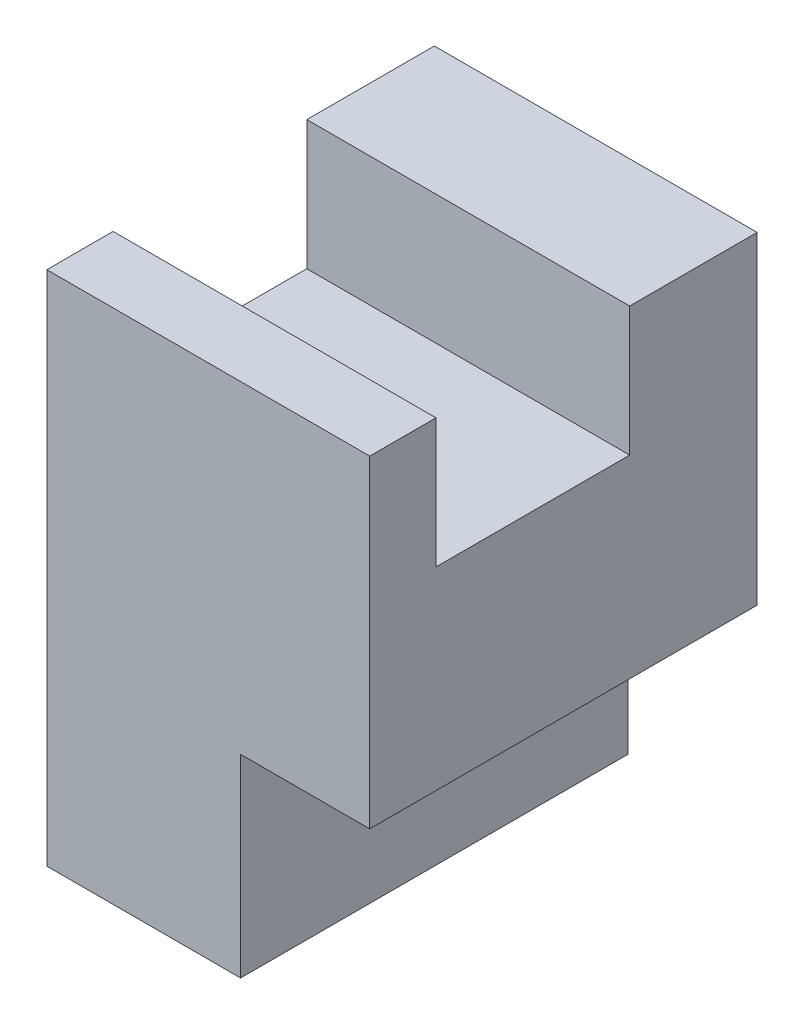
ISO-10303-21;
HEADER;
FILE_DESCRIPTION(('STEP AP214'),'2;1');
FILE_NAME('part.step','',(''),(''),'','','');
FILE_SCHEMA(('AUTOMOTIVE_DESIGN { 1 0 10303 214 1 1 1 1 }'));
ENDSEC;
DATA;
#1=APPLICATION_CONTEXT('core data for automotive mechanical design processes');
#2=APPLICATION_PROTOCOL_DEFINITION('international standard','automotive_design',2000,#1);
#3=PRODUCT_CONTEXT('',#1,'mechanical');
#4=PRODUCT('Part','Part','',(#3));
#5=PRODUCT_RELATED_PRODUCT_CATEGORY('part','',(#4));
#6=PRODUCT_DEFINITION_FORMATION('','',#4);
#7=PRODUCT_DEFINITION_CONTEXT('part definition',#1,'design');
#8=PRODUCT_DEFINITION('design','',#6,#7);
#9=PRODUCT_DEFINITION_SHAPE('','',#8);
#10=(LENGTH_UNIT() NAMED_UNIT(*) SI_UNIT(.MILLI.,.METRE.));
#11=(NAMED_UNIT(*) PLANE_ANGLE_UNIT() SI_UNIT($,.RADIAN.));
#12=(NAMED_UNIT(*) SI_UNIT($,.STERADIAN.) SOLID_ANGLE_UNIT());
#13=UNCERTAINTY_MEASURE_WITH_UNIT(LENGTH_MEASURE(1.E-05),#10,'distance_accuracy_value','');
#14=(GEOMETRIC_REPRESENTATION_CONTEXT(3) GLOBAL_UNCERTAINTY_ASSIGNED_CONTEXT((#13)) GLOBAL_UNIT_ASSIGNED_CONTEXT((#10,
#11,#12)) REPRESENTATION_CONTEXT('',''));
#15=CARTESIAN_POINT('',(0.,0.,0.));
#16=DIRECTION('',(0.,0.,1.));
#17=DIRECTION('',(1.,0.,0.));
#18=AXIS2_PLACEMENT_3D('',#15,#16,#17);
#19=CARTESIAN_POINT('',(25000.,40000.,30000.));
#20=DIRECTION('',(0.,-1.,0.));
#21=DIRECTION('',(0.,0.,-1.));
#22=AXIS2_PLACEMENT_3D('',#19,#20,#21);
#23=PLANE('',#22);
#24=DIRECTION('',(0.,0.,-1.));
#25=VECTOR('',#24,1.);
#26=CARTESIAN_POINT('',(0.,40000.,30000.));
#27=LINE('',#26,#25);
#28=CARTESIAN_POINT('',(0.,40000.,9869.96150036873));
#29=VERTEX_POINT('',#28);
#30=CARTESIAN_POINT('',(0.,40000.,0.));
#31=VERTEX_POINT('',#30);
#32=EDGE_CURVE('E89',#29,#31,#27,.T.);
#33=ORIENTED_EDGE('',*,*,#32,.F.);
#34=DIRECTION('',(-1.,0.,0.));
#35=VECTOR('',#34,1.);
#36=CARTESIAN_POINT('',(25000.,40000.,9869.96150036873));
#37=LINE('',#36,#35);
#38=CARTESIAN_POINT('',(25000.,40000.,9869.96150036873));
#39=VERTEX_POINT('',#38);
#40=EDGE_CURVE('E174',#39,#29,#37,.T.);
#41=ORIENTED_EDGE('',*,*,#40,.F.);
#42=DIRECTION('',(0.,0.,-1.));
#43=VECTOR('',#42,1.);
#44=CARTESIAN_POINT('',(25000.,40000.,30000.));
#45=LINE('',#44,#43);
#46=CARTESIAN_POINT('',(25000.,40000.,0.));
#47=VERTEX_POINT('',#46);
#48=EDGE_CURVE('E154',#39,#47,#45,.T.);
#49=ORIENTED_EDGE('',*,*,#48,.T.);
#50=DIRECTION('',(-1.,0.,0.));
#51=VECTOR('',#50,1.);
#52=CARTESIAN_POINT('',(25000.,40000.,0.));
#53=LINE('',#52,#51);
#54=EDGE_CURVE('E148',#47,#31,#53,.T.);
#55=ORIENTED_EDGE('',*,*,#54,.T.);
#56=EDGE_LOOP('',(#33,#41,#49,#55));
#57=FACE_BOUND('',#56,.T.);
#58=ADVANCED_FACE('F37',(#57),#23,.F.);
#59=CARTESIAN_POINT('',(0.,0.,30000.));
#60=DIRECTION('',(1.,0.,0.));
#61=DIRECTION('',(0.,0.,-1.));
#62=AXIS2_PLACEMENT_3D('',#59,#60,#61);
#63=PLANE('',#62);
#64=DIRECTION('',(0.,0.,1.));
#65=VECTOR('',#64,1.);
#66=CARTESIAN_POINT('',(0.,30000.,9869.96150036873));
#67=LINE('',#66,#65);
#68=CARTESIAN_POINT('',(0.,30000.,9869.96150036873));
#69=VERTEX_POINT('',#68);
#70=CARTESIAN_POINT('',(0.,30000.,24869.9615003687));
#71=VERTEX_POINT('',#70);
#72=EDGE_CURVE('E177',#69,#71,#67,.T.);
#73=ORIENTED_EDGE('',*,*,#72,.F.);
#74=DIRECTION('',(0.,1.,0.));
#75=VECTOR('',#74,1.);
#76=CARTESIAN_POINT('',(0.,30000.,9869.96150036873));
#77=LINE('',#76,#75);
#78=EDGE_CURVE('E141',#69,#29,#77,.T.);
#79=ORIENTED_EDGE('',*,*,#78,.T.);
#80=ORIENTED_EDGE('',*,*,#32,.T.);
#81=DIRECTION('',(0.,-1.,0.));
#82=VECTOR('',#81,1.);
#83=CARTESIAN_POINT('',(0.,0.,0.));
#84=LINE('',#83,#82);
#85=CARTESIAN_POINT('',(0.,0.,0.));
#86=VERTEX_POINT('',#85);
#87=EDGE_CURVE('E138',#31,#86,#84,.T.);
#88=ORIENTED_EDGE('',*,*,#87,.T.);
#89=DIRECTION('',(0.,0.,-1.));
#90=VECTOR('',#89,1.);
#91=CARTESIAN_POINT('',(0.,0.,30000.));
#92=LINE('',#91,#90);
#93=CARTESIAN_POINT('',(0.,0.,30000.));
#94=VERTEX_POINT('',#93);
#95=EDGE_CURVE('E11',#94,#86,#92,.T.);
#96=ORIENTED_EDGE('',*,*,#95,.F.);
#97=DIRECTION('',(0.,-1.,0.));
#98=VECTOR('',#97,1.);
#99=CARTESIAN_POINT('',(0.,0.,30000.));
#100=LINE('',#99,#98);
#101=CARTESIAN_POINT('',(0.,40000.,30000.));
#102=VERTEX_POINT('',#101);
#103=EDGE_CURVE('E150',#102,#94,#100,.T.);
#104=ORIENTED_EDGE('',*,*,#103,.F.);
#105=CARTESIAN_POINT('',(0.,40000.,24869.9615003687));
#106=VERTEX_POINT('',#105);
#107=EDGE_CURVE('E151',#102,#106,#27,.T.);
#108=ORIENTED_EDGE('',*,*,#107,.T.);
#109=DIRECTION('',(0.,1.,0.));
#110=VECTOR('',#109,1.);
#111=CARTESIAN_POINT('',(0.,30000.,24869.9615003687));
#112=LINE('',#111,#110);
#113=EDGE_CURVE('E52',#71,#106,#112,.T.);
#114=ORIENTED_EDGE('',*,*,#113,.F.);
#115=EDGE_LOOP('',(#73,#79,#80,#88,#96,#104,#108,#114));
#116=FACE_BOUND('',#115,.T.);
#117=ADVANCED_FACE('F39',(#116),#63,.F.);
#118=CARTESIAN_POINT('',(0.,0.,30000.));
#119=DIRECTION('',(0.,1.,0.));
#120=DIRECTION('',(0.,0.,1.));
#121=AXIS2_PLACEMENT_3D('',#118,#119,#120);
#122=PLANE('',#121);
#123=DIRECTION('',(1.,0.,0.));
#124=VECTOR('',#123,1.);
#125=CARTESIAN_POINT('',(0.,0.,0.));
#126=LINE('',#125,#124);
#127=CARTESIAN_POINT('',(15000.,0.,0.));
#128=VERTEX_POINT('',#127);
#129=EDGE_CURVE('E140',#86,#128,#126,.T.);
#130=ORIENTED_EDGE('',*,*,#129,.T.);
#131=DIRECTION('',(0.,0.,-1.));
#132=VECTOR('',#131,1.);
#133=CARTESIAN_POINT('',(15000.,0.,30000.));
#134=LINE('',#133,#132);
#135=CARTESIAN_POINT('',(15000.,0.,30000.));
#136=VERTEX_POINT('',#135);
#137=EDGE_CURVE('E45',#136,#128,#134,.T.);
#138=ORIENTED_EDGE('',*,*,#137,.F.);
#139=DIRECTION('',(1.,0.,0.));
#140=VECTOR('',#139,1.);
#141=CARTESIAN_POINT('',(0.,0.,30000.));
#142=LINE('',#141,#140);
#143=EDGE_CURVE('E97',#94,#136,#142,.T.);
#144=ORIENTED_EDGE('',*,*,#143,.F.);
#145=ORIENTED_EDGE('',*,*,#95,.T.);
#146=EDGE_LOOP('',(#130,#138,#144,#145));
#147=FACE_BOUND('',#146,.T.);
#148=ADVANCED_FACE('F196',(#147),#122,.F.);
#149=CARTESIAN_POINT('',(15000.,0.,30000.));
#150=DIRECTION('',(-1.,0.,0.));
#151=DIRECTION('',(0.,0.,1.));
#152=AXIS2_PLACEMENT_3D('',#149,#150,#151);
#153=PLANE('',#152);
#154=DIRECTION('',(0.,1.,0.));
#155=VECTOR('',#154,1.);
#156=CARTESIAN_POINT('',(15000.,0.,0.));
#157=LINE('',#156,#155);
#158=CARTESIAN_POINT('',(15000.,15000.,0.));
#159=VERTEX_POINT('',#158);
#160=EDGE_CURVE('E143',#128,#159,#157,.T.);
#161=ORIENTED_EDGE('',*,*,#160,.T.);
#162=DIRECTION('',(0.,0.,-1.));
#163=VECTOR('',#162,1.);
#164=CARTESIAN_POINT('',(15000.,15000.,30000.));
#165=LINE('',#164,#163);
#166=CARTESIAN_POINT('',(15000.,15000.,30000.));
#167=VERTEX_POINT('',#166);
#168=EDGE_CURVE('E127',#167,#159,#165,.T.);
#169=ORIENTED_EDGE('',*,*,#168,.F.);
#170=DIRECTION('',(0.,1.,0.));
#171=VECTOR('',#170,1.);
#172=CARTESIAN_POINT('',(15000.,0.,30000.));
#173=LINE('',#172,#171);
#174=EDGE_CURVE('E114',#136,#167,#173,.T.);
#175=ORIENTED_EDGE('',*,*,#174,.F.);
#176=ORIENTED_EDGE('',*,*,#137,.T.);
#177=EDGE_LOOP('',(#161,#169,#175,#176));
#178=FACE_BOUND('',#177,.T.);
#179=ADVANCED_FACE('F159',(#178),#153,.F.);
#180=CARTESIAN_POINT('',(15000.,15000.,30000.));
#181=DIRECTION('',(0.,1.,0.));
#182=DIRECTION('',(0.,0.,1.));
#183=AXIS2_PLACEMENT_3D('',#180,#181,#182);
#184=PLANE('',#183);
#185=DIRECTION('',(1.,0.,0.));
#186=VECTOR('',#185,1.);
#187=CARTESIAN_POINT('',(15000.,15000.,0.));
#188=LINE('',#187,#186);
#189=CARTESIAN_POINT('',(25000.,15000.,0.));
#190=VERTEX_POINT('',#189);
#191=EDGE_CURVE('E123',#159,#190,#188,.T.);
#192=ORIENTED_EDGE('',*,*,#191,.T.);
#193=DIRECTION('',(0.,0.,-1.));
#194=VECTOR('',#193,1.);
#195=CARTESIAN_POINT('',(25000.,15000.,30000.));
#196=LINE('',#195,#194);
#197=CARTESIAN_POINT('',(25000.,15000.,30000.));
#198=VERTEX_POINT('',#197);
#199=EDGE_CURVE('E120',#198,#190,#196,.T.);
#200=ORIENTED_EDGE('',*,*,#199,.F.);
#201=DIRECTION('',(1.,0.,0.));
#202=VECTOR('',#201,1.);
#203=CARTESIAN_POINT('',(15000.,15000.,30000.));
#204=LINE('',#203,#202);
#205=EDGE_CURVE('E107',#167,#198,#204,.T.);
#206=ORIENTED_EDGE('',*,*,#205,.F.);
#207=ORIENTED_EDGE('',*,*,#168,.T.);
#208=EDGE_LOOP('',(#192,#200,#206,#207));
#209=FACE_BOUND('',#208,.T.);
#210=ADVANCED_FACE('F121',(#209),#184,.F.);
#211=CARTESIAN_POINT('',(25000.,15000.,30000.));
#212=DIRECTION('',(-1.,0.,0.));
#213=DIRECTION('',(0.,0.,1.));
#214=AXIS2_PLACEMENT_3D('',#211,#212,#213);
#215=PLANE('',#214);
#216=ORIENTED_EDGE('',*,*,#48,.F.);
#217=DIRECTION('',(0.,1.,0.));
#218=VECTOR('',#217,1.);
#219=CARTESIAN_POINT('',(25000.,30000.,9869.96150036873));
#220=LINE('',#219,#218);
#221=CARTESIAN_POINT('',(25000.,30000.,9869.96150036873));
#222=VERTEX_POINT('',#221);
#223=EDGE_CURVE('E169',#222,#39,#220,.T.);
#224=ORIENTED_EDGE('',*,*,#223,.F.);
#225=DIRECTION('',(0.,0.,-1.));
#226=VECTOR('',#225,1.);
#227=CARTESIAN_POINT('',(25000.,30000.,24869.9615003687));
#228=LINE('',#227,#226);
#229=CARTESIAN_POINT('',(25000.,30000.,24869.9615003687));
#230=VERTEX_POINT('',#229);
#231=EDGE_CURVE('E229',#230,#222,#228,.T.);
#232=ORIENTED_EDGE('',*,*,#231,.F.);
#233=DIRECTION('',(0.,1.,0.));
#234=VECTOR('',#233,1.);
#235=CARTESIAN_POINT('',(25000.,30000.,24869.9615003687));
#236=LINE('',#235,#234);
#237=CARTESIAN_POINT('',(25000.,40000.,24869.9615003687));
#238=VERTEX_POINT('',#237);
#239=EDGE_CURVE('E188',#230,#238,#236,.T.);
#240=ORIENTED_EDGE('',*,*,#239,.T.);
#241=CARTESIAN_POINT('',(25000.,40000.,30000.));
#242=VERTEX_POINT('',#241);
#243=EDGE_CURVE('E128',#242,#238,#45,.T.);
#244=ORIENTED_EDGE('',*,*,#243,.F.);
#245=DIRECTION('',(0.,1.,0.));
#246=VECTOR('',#245,1.);
#247=CARTESIAN_POINT('',(25000.,15000.,30000.));
#248=LINE('',#247,#246);
#249=EDGE_CURVE('E111',#198,#242,#248,.T.);
#250=ORIENTED_EDGE('',*,*,#249,.F.);
#251=ORIENTED_EDGE('',*,*,#199,.T.);
#252=DIRECTION('',(0.,1.,0.));
#253=VECTOR('',#252,1.);
#254=CARTESIAN_POINT('',(25000.,15000.,0.));
#255=LINE('',#254,#253);
#256=EDGE_CURVE('E146',#190,#47,#255,.T.);
#257=ORIENTED_EDGE('',*,*,#256,.T.);
#258=EDGE_LOOP('',(#216,#224,#232,#240,#244,#250,#251,#257));
#259=FACE_BOUND('',#258,.T.);
#260=ADVANCED_FACE('F131',(#259),#215,.F.);
#261=ORIENTED_EDGE('',*,*,#243,.T.);
#262=DIRECTION('',(1.,0.,0.));
#263=VECTOR('',#262,1.);
#264=CARTESIAN_POINT('',(0.,40000.,24869.9615003687));
#265=LINE('',#264,#263);
#266=EDGE_CURVE('E178',#106,#238,#265,.T.);
#267=ORIENTED_EDGE('',*,*,#266,.F.);
#268=ORIENTED_EDGE('',*,*,#107,.F.);
#269=DIRECTION('',(-1.,0.,0.));
#270=VECTOR('',#269,1.);
#271=CARTESIAN_POINT('',(25000.,40000.,30000.));
#272=LINE('',#271,#270);
#273=EDGE_CURVE('E61',#242,#102,#272,.T.);
#274=ORIENTED_EDGE('',*,*,#273,.F.);
#275=EDGE_LOOP('',(#261,#267,#268,#274));
#276=FACE_BOUND('',#275,.T.);
#277=ADVANCED_FACE('F205',(#276),#23,.F.);
#278=CARTESIAN_POINT('',(0.,0.,30000.));
#279=DIRECTION('',(0.,0.,1.));
#280=DIRECTION('',(1.,0.,0.));
#281=AXIS2_PLACEMENT_3D('',#278,#279,#280);
#282=PLANE('',#281);
#283=ORIENTED_EDGE('',*,*,#103,.T.);
#284=ORIENTED_EDGE('',*,*,#143,.T.);
#285=ORIENTED_EDGE('',*,*,#174,.T.);
#286=ORIENTED_EDGE('',*,*,#205,.T.);
#287=ORIENTED_EDGE('',*,*,#249,.T.);
#288=ORIENTED_EDGE('',*,*,#273,.T.);
#289=EDGE_LOOP('',(#283,#284,#285,#286,#287,#288));
#290=FACE_BOUND('',#289,.T.);
#291=ADVANCED_FACE('F109',(#290),#282,.T.);
#292=CARTESIAN_POINT('',(0.,0.,0.));
#293=DIRECTION('',(0.,0.,1.));
#294=DIRECTION('',(1.,0.,0.));
#295=AXIS2_PLACEMENT_3D('',#292,#293,#294);
#296=PLANE('',#295);
#297=ORIENTED_EDGE('',*,*,#87,.F.);
#298=ORIENTED_EDGE('',*,*,#54,.F.);
#299=ORIENTED_EDGE('',*,*,#256,.F.);
#300=ORIENTED_EDGE('',*,*,#191,.F.);
#301=ORIENTED_EDGE('',*,*,#160,.F.);
#302=ORIENTED_EDGE('',*,*,#129,.F.);
#303=EDGE_LOOP('',(#297,#298,#299,#300,#301,#302));
#304=FACE_BOUND('',#303,.T.);
#305=ADVANCED_FACE('F162',(#304),#296,.F.);
#306=CARTESIAN_POINT('',(25000.,30000.,9869.96150036873));
#307=DIRECTION('',(0.,0.,-1.));
#308=DIRECTION('',(-1.,0.,0.));
#309=AXIS2_PLACEMENT_3D('',#306,#307,#308);
#310=PLANE('',#309);
#311=ORIENTED_EDGE('',*,*,#40,.T.);
#312=ORIENTED_EDGE('',*,*,#78,.F.);
#313=DIRECTION('',(-1.,0.,0.));
#314=VECTOR('',#313,1.);
#315=CARTESIAN_POINT('',(25000.,30000.,9869.96150036873));
#316=LINE('',#315,#314);
#317=EDGE_CURVE('E191',#222,#69,#316,.T.);
#318=ORIENTED_EDGE('',*,*,#317,.F.);
#319=ORIENTED_EDGE('',*,*,#223,.T.);
#320=EDGE_LOOP('',(#311,#312,#318,#319));
#321=FACE_BOUND('',#320,.T.);
#322=ADVANCED_FACE('F234',(#321),#310,.F.);
#323=CARTESIAN_POINT('',(0.,30000.,24869.9615003687));
#324=DIRECTION('',(0.,0.,1.));
#325=DIRECTION('',(1.,0.,0.));
#326=AXIS2_PLACEMENT_3D('',#323,#324,#325);
#327=PLANE('',#326);
#328=ORIENTED_EDGE('',*,*,#266,.T.);
#329=ORIENTED_EDGE('',*,*,#239,.F.);
#330=DIRECTION('',(1.,0.,0.));
#331=VECTOR('',#330,1.);
#332=CARTESIAN_POINT('',(0.,30000.,24869.9615003687));
#333=LINE('',#332,#331);
#334=EDGE_CURVE('E181',#71,#230,#333,.T.);
#335=ORIENTED_EDGE('',*,*,#334,.F.);
#336=ORIENTED_EDGE('',*,*,#113,.T.);
#337=EDGE_LOOP('',(#328,#329,#335,#336));
#338=FACE_BOUND('',#337,.T.);
#339=ADVANCED_FACE('F227',(#338),#327,.F.);
#340=CARTESIAN_POINT('',(0.,30000.,0.));
#341=DIRECTION('',(0.,1.,0.));
#342=DIRECTION('',(0.,0.,1.));
#343=AXIS2_PLACEMENT_3D('',#340,#341,#342);
#344=PLANE('',#343);
#345=ORIENTED_EDGE('',*,*,#72,.T.);
#346=ORIENTED_EDGE('',*,*,#334,.T.);
#347=ORIENTED_EDGE('',*,*,#231,.T.);
#348=ORIENTED_EDGE('',*,*,#317,.T.);
#349=EDGE_LOOP('',(#345,#346,#347,#348));
#350=FACE_BOUND('',#349,.T.);
#351=ADVANCED_FACE('F232',(#350),#344,.T.);
#352=CLOSED_SHELL('',(#58,#117,#148,#179,#210,#260,#277,#291,#305,#322,#339,#351));
#353=MANIFOLD_SOLID_BREP('B2',#352);
#354=ADVANCED_BREP_SHAPE_REPRESENTATION('',(#18,#353),#14);
#355=SHAPE_DEFINITION_REPRESENTATION(#9,#354);
ENDSEC;
END-ISO-10303-21;
